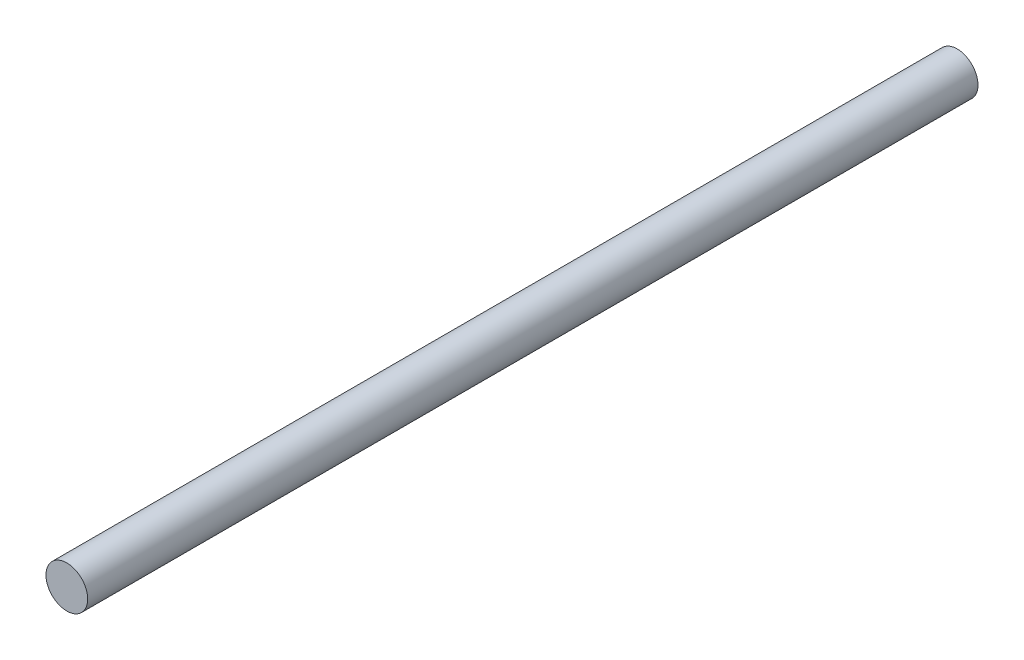
ISO-10303-21;
HEADER;
FILE_DESCRIPTION(('STEP AP214'),'2;1');
FILE_NAME('part.step','',(''),(''),'','','');
FILE_SCHEMA(('AUTOMOTIVE_DESIGN { 1 0 10303 214 1 1 1 1 }'));
ENDSEC;
DATA;
#1=APPLICATION_CONTEXT('core data for automotive mechanical design processes');
#2=APPLICATION_PROTOCOL_DEFINITION('international standard','automotive_design',2000,#1);
#3=PRODUCT_CONTEXT('',#1,'mechanical');
#4=PRODUCT('Part','Part','',(#3));
#5=PRODUCT_RELATED_PRODUCT_CATEGORY('part','',(#4));
#6=PRODUCT_DEFINITION_FORMATION('','',#4);
#7=PRODUCT_DEFINITION_CONTEXT('part definition',#1,'design');
#8=PRODUCT_DEFINITION('design','',#6,#7);
#9=PRODUCT_DEFINITION_SHAPE('','',#8);
#10=(LENGTH_UNIT() NAMED_UNIT(*) SI_UNIT(.MILLI.,.METRE.));
#11=(NAMED_UNIT(*) PLANE_ANGLE_UNIT() SI_UNIT($,.RADIAN.));
#12=(NAMED_UNIT(*) SI_UNIT($,.STERADIAN.) SOLID_ANGLE_UNIT());
#13=UNCERTAINTY_MEASURE_WITH_UNIT(LENGTH_MEASURE(1.E-05),#10,'distance_accuracy_value','');
#14=(GEOMETRIC_REPRESENTATION_CONTEXT(3) GLOBAL_UNCERTAINTY_ASSIGNED_CONTEXT((#13)) GLOBAL_UNIT_ASSIGNED_CONTEXT((#10,
#11,#12)) REPRESENTATION_CONTEXT('',''));
#15=CARTESIAN_POINT('',(0.,0.,0.));
#16=DIRECTION('',(0.,0.,1.));
#17=DIRECTION('',(1.,0.,0.));
#18=AXIS2_PLACEMENT_3D('',#15,#16,#17);
#19=CARTESIAN_POINT('',(0.,0.,203.2));
#20=DIRECTION('',(0.,0.,-1.));
#21=DIRECTION('',(-1.,0.,0.));
#22=AXIS2_PLACEMENT_3D('',#19,#20,#21);
#23=CYLINDRICAL_SURFACE('',#22,4.7625);
#24=CARTESIAN_POINT('',(0.,0.,203.2));
#25=DIRECTION('',(0.,0.,1.));
#26=DIRECTION('',(1.,0.,0.));
#27=AXIS2_PLACEMENT_3D('',#24,#25,#26);
#28=CIRCLE('',#27,4.7625);
#29=CARTESIAN_POINT('',(4.7625,0.,203.2));
#30=VERTEX_POINT('',#29);
#31=EDGE_CURVE('E10',#30,#30,#28,.T.);
#32=ORIENTED_EDGE('',*,*,#31,.F.);
#33=EDGE_LOOP('',(#32));
#34=FACE_BOUND('',#33,.T.);
#35=CARTESIAN_POINT('',(0.,0.,0.));
#36=DIRECTION('',(0.,0.,1.));
#37=DIRECTION('',(1.,0.,0.));
#38=AXIS2_PLACEMENT_3D('',#35,#36,#37);
#39=CIRCLE('',#38,4.7625);
#40=CARTESIAN_POINT('',(4.7625,0.,0.));
#41=VERTEX_POINT('',#40);
#42=EDGE_CURVE('E37',#41,#41,#39,.T.);
#43=ORIENTED_EDGE('',*,*,#42,.T.);
#44=EDGE_LOOP('',(#43));
#45=FACE_BOUND('',#44,.T.);
#46=ADVANCED_FACE('F34',(#34,#45),#23,.T.);
#47=CARTESIAN_POINT('',(0.,0.,203.2));
#48=DIRECTION('',(0.,0.,1.));
#49=DIRECTION('',(1.,0.,0.));
#50=AXIS2_PLACEMENT_3D('',#47,#48,#49);
#51=PLANE('',#50);
#52=ORIENTED_EDGE('',*,*,#31,.T.);
#53=EDGE_LOOP('',(#52));
#54=FACE_BOUND('',#53,.T.);
#55=ADVANCED_FACE('F49',(#54),#51,.T.);
#56=CARTESIAN_POINT('',(0.,0.,0.));
#57=DIRECTION('',(0.,0.,1.));
#58=DIRECTION('',(1.,0.,0.));
#59=AXIS2_PLACEMENT_3D('',#56,#57,#58);
#60=PLANE('',#59);
#61=ORIENTED_EDGE('',*,*,#42,.F.);
#62=EDGE_LOOP('',(#61));
#63=FACE_BOUND('',#62,.T.);
#64=ADVANCED_FACE('F47',(#63),#60,.F.);
#65=CLOSED_SHELL('',(#46,#55,#64));
#66=MANIFOLD_SOLID_BREP('B2',#65);
#67=ADVANCED_BREP_SHAPE_REPRESENTATION('',(#18,#66),#14);
#68=SHAPE_DEFINITION_REPRESENTATION(#9,#67);
ENDSEC;
END-ISO-10303-21;
